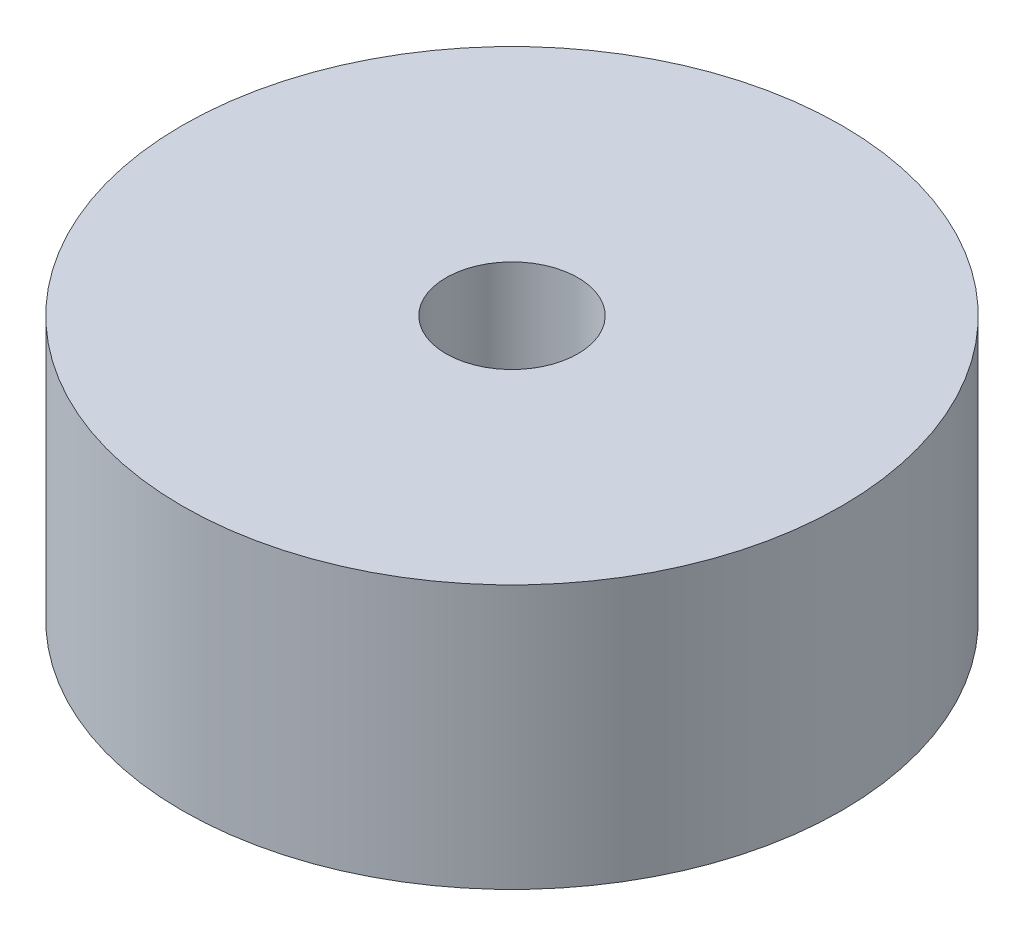
ISO-10303-21;
HEADER;
FILE_DESCRIPTION(('STEP AP214'),'2;1');
FILE_NAME('part.step','',(''),(''),'','','');
FILE_SCHEMA(('AUTOMOTIVE_DESIGN { 1 0 10303 214 1 1 1 1 }'));
ENDSEC;
DATA;
#1=APPLICATION_CONTEXT('core data for automotive mechanical design processes');
#2=APPLICATION_PROTOCOL_DEFINITION('international standard','automotive_design',2000,#1);
#3=PRODUCT_CONTEXT('',#1,'mechanical');
#4=PRODUCT('Part','Part','',(#3));
#5=PRODUCT_RELATED_PRODUCT_CATEGORY('part','',(#4));
#6=PRODUCT_DEFINITION_FORMATION('','',#4);
#7=PRODUCT_DEFINITION_CONTEXT('part definition',#1,'design');
#8=PRODUCT_DEFINITION('design','',#6,#7);
#9=PRODUCT_DEFINITION_SHAPE('','',#8);
#10=(LENGTH_UNIT() NAMED_UNIT(*) SI_UNIT(.MILLI.,.METRE.));
#11=(NAMED_UNIT(*) PLANE_ANGLE_UNIT() SI_UNIT($,.RADIAN.));
#12=(NAMED_UNIT(*) SI_UNIT($,.STERADIAN.) SOLID_ANGLE_UNIT());
#13=UNCERTAINTY_MEASURE_WITH_UNIT(LENGTH_MEASURE(1.E-05),#10,'distance_accuracy_value','');
#14=(GEOMETRIC_REPRESENTATION_CONTEXT(3) GLOBAL_UNCERTAINTY_ASSIGNED_CONTEXT((#13)) GLOBAL_UNIT_ASSIGNED_CONTEXT((#10,
#11,#12)) REPRESENTATION_CONTEXT('',''));
#15=CARTESIAN_POINT('',(0.,0.,0.));
#16=DIRECTION('',(0.,0.,1.));
#17=DIRECTION('',(1.,0.,0.));
#18=AXIS2_PLACEMENT_3D('',#15,#16,#17);
#19=CARTESIAN_POINT('',(0.,12.,0.));
#20=DIRECTION('',(0.,-1.,0.));
#21=DIRECTION('',(0.,0.,-1.));
#22=AXIS2_PLACEMENT_3D('',#19,#20,#21);
#23=CYLINDRICAL_SURFACE('',#22,15.);
#24=CARTESIAN_POINT('',(0.,12.,0.));
#25=DIRECTION('',(0.,1.,0.));
#26=DIRECTION('',(0.,0.,1.));
#27=AXIS2_PLACEMENT_3D('',#24,#25,#26);
#28=CIRCLE('',#27,15.);
#29=CARTESIAN_POINT('',(0.,12.,15.));
#30=VERTEX_POINT('',#29);
#31=EDGE_CURVE('E10',#30,#30,#28,.T.);
#32=ORIENTED_EDGE('',*,*,#31,.F.);
#33=EDGE_LOOP('',(#32));
#34=FACE_BOUND('',#33,.T.);
#35=CARTESIAN_POINT('',(0.,0.,0.));
#36=DIRECTION('',(0.,1.,0.));
#37=DIRECTION('',(0.,0.,1.));
#38=AXIS2_PLACEMENT_3D('',#35,#36,#37);
#39=CIRCLE('',#38,15.);
#40=CARTESIAN_POINT('',(0.,0.,15.));
#41=VERTEX_POINT('',#40);
#42=EDGE_CURVE('E32',#41,#41,#39,.T.);
#43=ORIENTED_EDGE('',*,*,#42,.T.);
#44=EDGE_LOOP('',(#43));
#45=FACE_BOUND('',#44,.T.);
#46=ADVANCED_FACE('F29',(#34,#45),#23,.T.);
#47=CARTESIAN_POINT('',(0.,12.,0.));
#48=DIRECTION('',(0.,1.,0.));
#49=DIRECTION('',(0.,0.,1.));
#50=AXIS2_PLACEMENT_3D('',#47,#48,#49);
#51=PLANE('',#50);
#52=CARTESIAN_POINT('',(0.,12.,0.));
#53=DIRECTION('',(0.,1.,0.));
#54=DIRECTION('',(0.,0.,1.));
#55=AXIS2_PLACEMENT_3D('',#52,#53,#54);
#56=CIRCLE('',#55,3.);
#57=CARTESIAN_POINT('',(0.,12.,3.));
#58=VERTEX_POINT('',#57);
#59=EDGE_CURVE('E41',#58,#58,#56,.T.);
#60=ORIENTED_EDGE('',*,*,#59,.F.);
#61=EDGE_LOOP('',(#60));
#62=FACE_BOUND('',#61,.T.);
#63=ORIENTED_EDGE('',*,*,#31,.T.);
#64=EDGE_LOOP('',(#63));
#65=FACE_BOUND('',#64,.T.);
#66=ADVANCED_FACE('F56',(#62,#65),#51,.T.);
#67=CARTESIAN_POINT('',(0.,0.,0.));
#68=DIRECTION('',(0.,1.,0.));
#69=DIRECTION('',(0.,0.,1.));
#70=AXIS2_PLACEMENT_3D('',#67,#68,#69);
#71=PLANE('',#70);
#72=CARTESIAN_POINT('',(0.,0.,0.));
#73=DIRECTION('',(0.,1.,0.));
#74=DIRECTION('',(0.,0.,1.));
#75=AXIS2_PLACEMENT_3D('',#72,#73,#74);
#76=CIRCLE('',#75,3.);
#77=CARTESIAN_POINT('',(0.,0.,3.));
#78=VERTEX_POINT('',#77);
#79=EDGE_CURVE('E39',#78,#78,#76,.T.);
#80=ORIENTED_EDGE('',*,*,#79,.T.);
#81=EDGE_LOOP('',(#80));
#82=FACE_BOUND('',#81,.T.);
#83=ORIENTED_EDGE('',*,*,#42,.F.);
#84=EDGE_LOOP('',(#83));
#85=FACE_BOUND('',#84,.T.);
#86=ADVANCED_FACE('F47',(#82,#85),#71,.F.);
#87=CARTESIAN_POINT('',(0.,0.,0.));
#88=DIRECTION('',(0.,1.,0.));
#89=DIRECTION('',(0.,0.,1.));
#90=AXIS2_PLACEMENT_3D('',#87,#88,#89);
#91=CYLINDRICAL_SURFACE('',#90,3.);
#92=ORIENTED_EDGE('',*,*,#79,.F.);
#93=EDGE_LOOP('',(#92));
#94=FACE_BOUND('',#93,.T.);
#95=ORIENTED_EDGE('',*,*,#59,.T.);
#96=EDGE_LOOP('',(#95));
#97=FACE_BOUND('',#96,.T.);
#98=ADVANCED_FACE('F50',(#94,#97),#91,.F.);
#99=CLOSED_SHELL('',(#46,#66,#86,#98));
#100=MANIFOLD_SOLID_BREP('B2',#99);
#101=ADVANCED_BREP_SHAPE_REPRESENTATION('',(#18,#100),#14);
#102=SHAPE_DEFINITION_REPRESENTATION(#9,#101);
ENDSEC;
END-ISO-10303-21;
